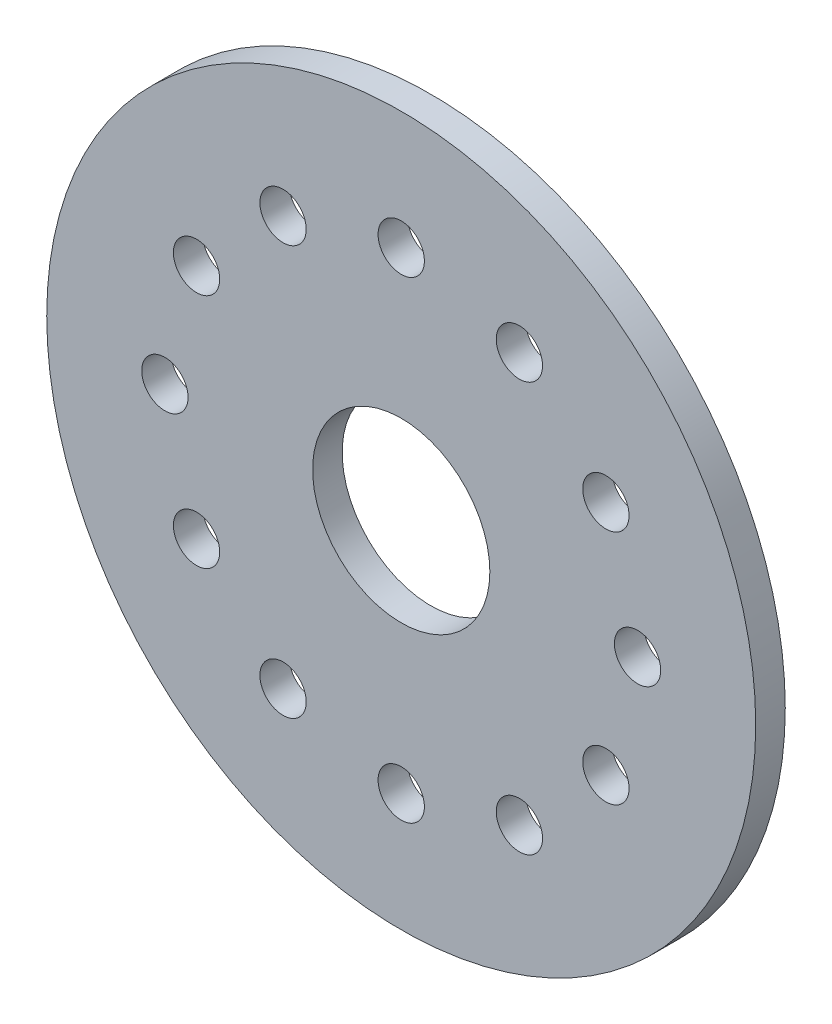
ISO-10303-21;
HEADER;
FILE_DESCRIPTION(('STEP AP214'),'2;1');
FILE_NAME('part.step','',(''),(''),'','','');
FILE_SCHEMA(('AUTOMOTIVE_DESIGN { 1 0 10303 214 1 1 1 1 }'));
ENDSEC;
DATA;
#1=APPLICATION_CONTEXT('core data for automotive mechanical design processes');
#2=APPLICATION_PROTOCOL_DEFINITION('international standard','automotive_design',2000,#1);
#3=PRODUCT_CONTEXT('',#1,'mechanical');
#4=PRODUCT('Part','Part','',(#3));
#5=PRODUCT_RELATED_PRODUCT_CATEGORY('part','',(#4));
#6=PRODUCT_DEFINITION_FORMATION('','',#4);
#7=PRODUCT_DEFINITION_CONTEXT('part definition',#1,'design');
#8=PRODUCT_DEFINITION('design','',#6,#7);
#9=PRODUCT_DEFINITION_SHAPE('','',#8);
#10=(LENGTH_UNIT() NAMED_UNIT(*) SI_UNIT(.MILLI.,.METRE.));
#11=(NAMED_UNIT(*) PLANE_ANGLE_UNIT() SI_UNIT($,.RADIAN.));
#12=(NAMED_UNIT(*) SI_UNIT($,.STERADIAN.) SOLID_ANGLE_UNIT());
#13=UNCERTAINTY_MEASURE_WITH_UNIT(LENGTH_MEASURE(1.E-05),#10,'distance_accuracy_value','');
#14=(GEOMETRIC_REPRESENTATION_CONTEXT(3) GLOBAL_UNCERTAINTY_ASSIGNED_CONTEXT((#13)) GLOBAL_UNIT_ASSIGNED_CONTEXT((#10,
#11,#12)) REPRESENTATION_CONTEXT('',''));
#15=CARTESIAN_POINT('',(0.,0.,0.));
#16=DIRECTION('',(0.,0.,1.));
#17=DIRECTION('',(1.,0.,0.));
#18=AXIS2_PLACEMENT_3D('',#15,#16,#17);
#19=CARTESIAN_POINT('',(0.,0.,3.175));
#20=DIRECTION('',(0.,0.,1.));
#21=DIRECTION('',(1.,0.,0.));
#22=AXIS2_PLACEMENT_3D('',#19,#20,#21);
#23=PLANE('',#22);
#24=CARTESIAN_POINT('',(-21.9970452561247,12.7,3.175));
#25=DIRECTION('',(0.,0.,1.));
#26=DIRECTION('',(1.,0.,0.));
#27=AXIS2_PLACEMENT_3D('',#24,#25,#26);
#28=CIRCLE('',#27,2.4892);
#29=CARTESIAN_POINT('',(-19.5078452561247,12.7,3.175));
#30=VERTEX_POINT('',#29);
#31=EDGE_CURVE('E142',#30,#30,#28,.T.);
#32=ORIENTED_EDGE('',*,*,#31,.F.);
#33=EDGE_LOOP('',(#32));
#34=FACE_BOUND('',#33,.T.);
#35=CARTESIAN_POINT('',(-21.9970452561247,-12.7,3.175));
#36=DIRECTION('',(0.,0.,1.));
#37=DIRECTION('',(1.,0.,0.));
#38=AXIS2_PLACEMENT_3D('',#35,#36,#37);
#39=CIRCLE('',#38,2.4892);
#40=CARTESIAN_POINT('',(-19.5078452561247,-12.7,3.175));
#41=VERTEX_POINT('',#40);
#42=EDGE_CURVE('E126',#41,#41,#39,.T.);
#43=ORIENTED_EDGE('',*,*,#42,.F.);
#44=EDGE_LOOP('',(#43));
#45=FACE_BOUND('',#44,.T.);
#46=CARTESIAN_POINT('',(0.,-25.4,3.175));
#47=DIRECTION('',(0.,0.,1.));
#48=DIRECTION('',(1.,0.,0.));
#49=AXIS2_PLACEMENT_3D('',#46,#47,#48);
#50=CIRCLE('',#49,2.4892);
#51=CARTESIAN_POINT('',(2.4892,-25.4,3.175));
#52=VERTEX_POINT('',#51);
#53=EDGE_CURVE('E110',#52,#52,#50,.T.);
#54=ORIENTED_EDGE('',*,*,#53,.F.);
#55=EDGE_LOOP('',(#54));
#56=FACE_BOUND('',#55,.T.);
#57=CARTESIAN_POINT('',(21.9970452561247,-12.7,3.175));
#58=DIRECTION('',(0.,0.,1.));
#59=DIRECTION('',(1.,0.,0.));
#60=AXIS2_PLACEMENT_3D('',#57,#58,#59);
#61=CIRCLE('',#60,2.4892);
#62=CARTESIAN_POINT('',(24.4862452561247,-12.7,3.175));
#63=VERTEX_POINT('',#62);
#64=EDGE_CURVE('E94',#63,#63,#61,.T.);
#65=ORIENTED_EDGE('',*,*,#64,.F.);
#66=EDGE_LOOP('',(#65));
#67=FACE_BOUND('',#66,.T.);
#68=CARTESIAN_POINT('',(21.9970452561247,12.7,3.175));
#69=DIRECTION('',(0.,0.,1.));
#70=DIRECTION('',(1.,0.,0.));
#71=AXIS2_PLACEMENT_3D('',#68,#69,#70);
#72=CIRCLE('',#71,2.4892);
#73=CARTESIAN_POINT('',(24.4862452561247,12.7,3.175));
#74=VERTEX_POINT('',#73);
#75=EDGE_CURVE('E78',#74,#74,#72,.T.);
#76=ORIENTED_EDGE('',*,*,#75,.F.);
#77=EDGE_LOOP('',(#76));
#78=FACE_BOUND('',#77,.T.);
#79=CARTESIAN_POINT('',(0.,25.4,3.175));
#80=DIRECTION('',(0.,0.,1.));
#81=DIRECTION('',(1.,0.,0.));
#82=AXIS2_PLACEMENT_3D('',#79,#80,#81);
#83=CIRCLE('',#82,2.4892);
#84=CARTESIAN_POINT('',(2.4892,25.4,3.175));
#85=VERTEX_POINT('',#84);
#86=EDGE_CURVE('E62',#85,#85,#83,.T.);
#87=ORIENTED_EDGE('',*,*,#86,.F.);
#88=EDGE_LOOP('',(#87));
#89=FACE_BOUND('',#88,.T.);
#90=CARTESIAN_POINT('',(0.,0.,3.175));
#91=DIRECTION('',(0.,0.,1.));
#92=DIRECTION('',(1.,0.,0.));
#93=AXIS2_PLACEMENT_3D('',#90,#91,#92);
#94=CIRCLE('',#93,38.1);
#95=CARTESIAN_POINT('',(38.1,0.,3.175));
#96=VERTEX_POINT('',#95);
#97=EDGE_CURVE('E10',#96,#96,#94,.T.);
#98=ORIENTED_EDGE('',*,*,#97,.T.);
#99=EDGE_LOOP('',(#98));
#100=FACE_BOUND('',#99,.T.);
#101=CARTESIAN_POINT('',(0.,0.,3.175));
#102=DIRECTION('',(0.,0.,1.));
#103=DIRECTION('',(1.,0.,0.));
#104=AXIS2_PLACEMENT_3D('',#101,#102,#103);
#105=CIRCLE('',#104,9.525);
#106=CARTESIAN_POINT('',(9.525,0.,3.175));
#107=VERTEX_POINT('',#106);
#108=EDGE_CURVE('E56',#107,#107,#105,.T.);
#109=ORIENTED_EDGE('',*,*,#108,.F.);
#110=EDGE_LOOP('',(#109));
#111=FACE_BOUND('',#110,.T.);
#112=CARTESIAN_POINT('',(12.7,21.9970452561247,3.175));
#113=DIRECTION('',(0.,0.,1.));
#114=DIRECTION('',(1.,0.,0.));
#115=AXIS2_PLACEMENT_3D('',#112,#113,#114);
#116=CIRCLE('',#115,2.4892);
#117=CARTESIAN_POINT('',(15.1892,21.9970452561247,3.175));
#118=VERTEX_POINT('',#117);
#119=EDGE_CURVE('E70',#118,#118,#116,.T.);
#120=ORIENTED_EDGE('',*,*,#119,.F.);
#121=EDGE_LOOP('',(#120));
#122=FACE_BOUND('',#121,.T.);
#123=CARTESIAN_POINT('',(25.4,0.,3.175));
#124=DIRECTION('',(0.,0.,1.));
#125=DIRECTION('',(1.,0.,0.));
#126=AXIS2_PLACEMENT_3D('',#123,#124,#125);
#127=CIRCLE('',#126,2.4892);
#128=CARTESIAN_POINT('',(27.8892,0.,3.175));
#129=VERTEX_POINT('',#128);
#130=EDGE_CURVE('E86',#129,#129,#127,.T.);
#131=ORIENTED_EDGE('',*,*,#130,.F.);
#132=EDGE_LOOP('',(#131));
#133=FACE_BOUND('',#132,.T.);
#134=CARTESIAN_POINT('',(12.7,-21.9970452561247,3.175));
#135=DIRECTION('',(0.,0.,1.));
#136=DIRECTION('',(1.,0.,0.));
#137=AXIS2_PLACEMENT_3D('',#134,#135,#136);
#138=CIRCLE('',#137,2.4892);
#139=CARTESIAN_POINT('',(15.1892,-21.9970452561247,3.175));
#140=VERTEX_POINT('',#139);
#141=EDGE_CURVE('E102',#140,#140,#138,.T.);
#142=ORIENTED_EDGE('',*,*,#141,.F.);
#143=EDGE_LOOP('',(#142));
#144=FACE_BOUND('',#143,.T.);
#145=CARTESIAN_POINT('',(-12.7,-21.9970452561247,3.175));
#146=DIRECTION('',(0.,0.,1.));
#147=DIRECTION('',(1.,0.,0.));
#148=AXIS2_PLACEMENT_3D('',#145,#146,#147);
#149=CIRCLE('',#148,2.4892);
#150=CARTESIAN_POINT('',(-10.2108,-21.9970452561247,3.175));
#151=VERTEX_POINT('',#150);
#152=EDGE_CURVE('E118',#151,#151,#149,.T.);
#153=ORIENTED_EDGE('',*,*,#152,.F.);
#154=EDGE_LOOP('',(#153));
#155=FACE_BOUND('',#154,.T.);
#156=CARTESIAN_POINT('',(-25.4,0.,3.175));
#157=DIRECTION('',(0.,0.,1.));
#158=DIRECTION('',(1.,0.,0.));
#159=AXIS2_PLACEMENT_3D('',#156,#157,#158);
#160=CIRCLE('',#159,2.4892);
#161=CARTESIAN_POINT('',(-22.9108,0.,3.175));
#162=VERTEX_POINT('',#161);
#163=EDGE_CURVE('E134',#162,#162,#160,.T.);
#164=ORIENTED_EDGE('',*,*,#163,.F.);
#165=EDGE_LOOP('',(#164));
#166=FACE_BOUND('',#165,.T.);
#167=CARTESIAN_POINT('',(-12.7,21.9970452561247,3.175));
#168=DIRECTION('',(0.,0.,1.));
#169=DIRECTION('',(1.,0.,0.));
#170=AXIS2_PLACEMENT_3D('',#167,#168,#169);
#171=CIRCLE('',#170,2.4892);
#172=CARTESIAN_POINT('',(-10.2108,21.9970452561247,3.175));
#173=VERTEX_POINT('',#172);
#174=EDGE_CURVE('E150',#173,#173,#171,.T.);
#175=ORIENTED_EDGE('',*,*,#174,.F.);
#176=EDGE_LOOP('',(#175));
#177=FACE_BOUND('',#176,.T.);
#178=ADVANCED_FACE('F43',(#34,#45,#56,#67,#78,#89,#100,#111,#122,#133,#144,#155,#166,#177),#23,.T.);
#179=CARTESIAN_POINT('',(0.,0.,0.));
#180=DIRECTION('',(0.,0.,1.));
#181=DIRECTION('',(1.,0.,0.));
#182=AXIS2_PLACEMENT_3D('',#179,#180,#181);
#183=PLANE('',#182);
#184=CARTESIAN_POINT('',(0.,0.,0.));
#185=DIRECTION('',(0.,0.,1.));
#186=DIRECTION('',(1.,0.,0.));
#187=AXIS2_PLACEMENT_3D('',#184,#185,#186);
#188=CIRCLE('',#187,38.1);
#189=CARTESIAN_POINT('',(38.1,0.,0.));
#190=VERTEX_POINT('',#189);
#191=EDGE_CURVE('E47',#190,#190,#188,.T.);
#192=ORIENTED_EDGE('',*,*,#191,.F.);
#193=EDGE_LOOP('',(#192));
#194=FACE_BOUND('',#193,.T.);
#195=CARTESIAN_POINT('',(0.,0.,0.));
#196=DIRECTION('',(0.,0.,1.));
#197=DIRECTION('',(1.,0.,0.));
#198=AXIS2_PLACEMENT_3D('',#195,#196,#197);
#199=CIRCLE('',#198,9.525);
#200=CARTESIAN_POINT('',(9.525,0.,0.));
#201=VERTEX_POINT('',#200);
#202=EDGE_CURVE('E58',#201,#201,#199,.T.);
#203=ORIENTED_EDGE('',*,*,#202,.T.);
#204=EDGE_LOOP('',(#203));
#205=FACE_BOUND('',#204,.T.);
#206=CARTESIAN_POINT('',(0.,25.4,0.));
#207=DIRECTION('',(0.,0.,1.));
#208=DIRECTION('',(1.,0.,0.));
#209=AXIS2_PLACEMENT_3D('',#206,#207,#208);
#210=CIRCLE('',#209,2.4892);
#211=CARTESIAN_POINT('',(2.4892,25.4,0.));
#212=VERTEX_POINT('',#211);
#213=EDGE_CURVE('E66',#212,#212,#210,.T.);
#214=ORIENTED_EDGE('',*,*,#213,.T.);
#215=EDGE_LOOP('',(#214));
#216=FACE_BOUND('',#215,.T.);
#217=CARTESIAN_POINT('',(12.7,21.9970452561247,0.));
#218=DIRECTION('',(0.,0.,1.));
#219=DIRECTION('',(1.,0.,0.));
#220=AXIS2_PLACEMENT_3D('',#217,#218,#219);
#221=CIRCLE('',#220,2.4892);
#222=CARTESIAN_POINT('',(15.1892,21.9970452561247,0.));
#223=VERTEX_POINT('',#222);
#224=EDGE_CURVE('E74',#223,#223,#221,.T.);
#225=ORIENTED_EDGE('',*,*,#224,.T.);
#226=EDGE_LOOP('',(#225));
#227=FACE_BOUND('',#226,.T.);
#228=CARTESIAN_POINT('',(21.9970452561247,12.7,0.));
#229=DIRECTION('',(0.,0.,1.));
#230=DIRECTION('',(1.,0.,0.));
#231=AXIS2_PLACEMENT_3D('',#228,#229,#230);
#232=CIRCLE('',#231,2.4892);
#233=CARTESIAN_POINT('',(24.4862452561247,12.7,0.));
#234=VERTEX_POINT('',#233);
#235=EDGE_CURVE('E82',#234,#234,#232,.T.);
#236=ORIENTED_EDGE('',*,*,#235,.T.);
#237=EDGE_LOOP('',(#236));
#238=FACE_BOUND('',#237,.T.);
#239=CARTESIAN_POINT('',(25.4,0.,0.));
#240=DIRECTION('',(0.,0.,1.));
#241=DIRECTION('',(1.,0.,0.));
#242=AXIS2_PLACEMENT_3D('',#239,#240,#241);
#243=CIRCLE('',#242,2.4892);
#244=CARTESIAN_POINT('',(27.8892,0.,0.));
#245=VERTEX_POINT('',#244);
#246=EDGE_CURVE('E90',#245,#245,#243,.T.);
#247=ORIENTED_EDGE('',*,*,#246,.T.);
#248=EDGE_LOOP('',(#247));
#249=FACE_BOUND('',#248,.T.);
#250=CARTESIAN_POINT('',(21.9970452561247,-12.7,0.));
#251=DIRECTION('',(0.,0.,1.));
#252=DIRECTION('',(1.,0.,0.));
#253=AXIS2_PLACEMENT_3D('',#250,#251,#252);
#254=CIRCLE('',#253,2.4892);
#255=CARTESIAN_POINT('',(24.4862452561247,-12.7,0.));
#256=VERTEX_POINT('',#255);
#257=EDGE_CURVE('E98',#256,#256,#254,.T.);
#258=ORIENTED_EDGE('',*,*,#257,.T.);
#259=EDGE_LOOP('',(#258));
#260=FACE_BOUND('',#259,.T.);
#261=CARTESIAN_POINT('',(12.7,-21.9970452561247,0.));
#262=DIRECTION('',(0.,0.,1.));
#263=DIRECTION('',(1.,0.,0.));
#264=AXIS2_PLACEMENT_3D('',#261,#262,#263);
#265=CIRCLE('',#264,2.4892);
#266=CARTESIAN_POINT('',(15.1892,-21.9970452561247,0.));
#267=VERTEX_POINT('',#266);
#268=EDGE_CURVE('E106',#267,#267,#265,.T.);
#269=ORIENTED_EDGE('',*,*,#268,.T.);
#270=EDGE_LOOP('',(#269));
#271=FACE_BOUND('',#270,.T.);
#272=CARTESIAN_POINT('',(0.,-25.4,0.));
#273=DIRECTION('',(0.,0.,1.));
#274=DIRECTION('',(1.,0.,0.));
#275=AXIS2_PLACEMENT_3D('',#272,#273,#274);
#276=CIRCLE('',#275,2.4892);
#277=CARTESIAN_POINT('',(2.4892,-25.4,0.));
#278=VERTEX_POINT('',#277);
#279=EDGE_CURVE('E114',#278,#278,#276,.T.);
#280=ORIENTED_EDGE('',*,*,#279,.T.);
#281=EDGE_LOOP('',(#280));
#282=FACE_BOUND('',#281,.T.);
#283=CARTESIAN_POINT('',(-12.7,-21.9970452561247,0.));
#284=DIRECTION('',(0.,0.,1.));
#285=DIRECTION('',(1.,0.,0.));
#286=AXIS2_PLACEMENT_3D('',#283,#284,#285);
#287=CIRCLE('',#286,2.4892);
#288=CARTESIAN_POINT('',(-10.2108,-21.9970452561247,0.));
#289=VERTEX_POINT('',#288);
#290=EDGE_CURVE('E122',#289,#289,#287,.T.);
#291=ORIENTED_EDGE('',*,*,#290,.T.);
#292=EDGE_LOOP('',(#291));
#293=FACE_BOUND('',#292,.T.);
#294=CARTESIAN_POINT('',(-21.9970452561247,-12.7,0.));
#295=DIRECTION('',(0.,0.,1.));
#296=DIRECTION('',(1.,0.,0.));
#297=AXIS2_PLACEMENT_3D('',#294,#295,#296);
#298=CIRCLE('',#297,2.4892);
#299=CARTESIAN_POINT('',(-19.5078452561247,-12.7,0.));
#300=VERTEX_POINT('',#299);
#301=EDGE_CURVE('E130',#300,#300,#298,.T.);
#302=ORIENTED_EDGE('',*,*,#301,.T.);
#303=EDGE_LOOP('',(#302));
#304=FACE_BOUND('',#303,.T.);
#305=CARTESIAN_POINT('',(-25.4,0.,0.));
#306=DIRECTION('',(0.,0.,1.));
#307=DIRECTION('',(1.,0.,0.));
#308=AXIS2_PLACEMENT_3D('',#305,#306,#307);
#309=CIRCLE('',#308,2.4892);
#310=CARTESIAN_POINT('',(-22.9108,0.,0.));
#311=VERTEX_POINT('',#310);
#312=EDGE_CURVE('E138',#311,#311,#309,.T.);
#313=ORIENTED_EDGE('',*,*,#312,.T.);
#314=EDGE_LOOP('',(#313));
#315=FACE_BOUND('',#314,.T.);
#316=CARTESIAN_POINT('',(-21.9970452561247,12.7,0.));
#317=DIRECTION('',(0.,0.,1.));
#318=DIRECTION('',(1.,0.,0.));
#319=AXIS2_PLACEMENT_3D('',#316,#317,#318);
#320=CIRCLE('',#319,2.4892);
#321=CARTESIAN_POINT('',(-19.5078452561247,12.7,0.));
#322=VERTEX_POINT('',#321);
#323=EDGE_CURVE('E146',#322,#322,#320,.T.);
#324=ORIENTED_EDGE('',*,*,#323,.T.);
#325=EDGE_LOOP('',(#324));
#326=FACE_BOUND('',#325,.T.);
#327=CARTESIAN_POINT('',(-12.7,21.9970452561247,0.));
#328=DIRECTION('',(0.,0.,1.));
#329=DIRECTION('',(1.,0.,0.));
#330=AXIS2_PLACEMENT_3D('',#327,#328,#329);
#331=CIRCLE('',#330,2.4892);
#332=CARTESIAN_POINT('',(-10.2108,21.9970452561247,0.));
#333=VERTEX_POINT('',#332);
#334=EDGE_CURVE('E154',#333,#333,#331,.T.);
#335=ORIENTED_EDGE('',*,*,#334,.T.);
#336=EDGE_LOOP('',(#335));
#337=FACE_BOUND('',#336,.T.);
#338=ADVANCED_FACE('F166',(#194,#205,#216,#227,#238,#249,#260,#271,#282,#293,#304,#315,#326,
#337),#183,.F.);
#339=CARTESIAN_POINT('',(0.,0.,3.175));
#340=DIRECTION('',(0.,0.,-1.));
#341=DIRECTION('',(-1.,0.,0.));
#342=AXIS2_PLACEMENT_3D('',#339,#340,#341);
#343=CYLINDRICAL_SURFACE('',#342,38.1);
#344=ORIENTED_EDGE('',*,*,#97,.F.);
#345=EDGE_LOOP('',(#344));
#346=FACE_BOUND('',#345,.T.);
#347=ORIENTED_EDGE('',*,*,#191,.T.);
#348=EDGE_LOOP('',(#347));
#349=FACE_BOUND('',#348,.T.);
#350=ADVANCED_FACE('F45',(#346,#349),#343,.T.);
#351=CARTESIAN_POINT('',(0.,0.,3.175));
#352=DIRECTION('',(0.,0.,-1.));
#353=DIRECTION('',(-1.,0.,0.));
#354=AXIS2_PLACEMENT_3D('',#351,#352,#353);
#355=CYLINDRICAL_SURFACE('',#354,9.525);
#356=ORIENTED_EDGE('',*,*,#108,.T.);
#357=EDGE_LOOP('',(#356));
#358=FACE_BOUND('',#357,.T.);
#359=ORIENTED_EDGE('',*,*,#202,.F.);
#360=EDGE_LOOP('',(#359));
#361=FACE_BOUND('',#360,.T.);
#362=ADVANCED_FACE('F176',(#358,#361),#355,.F.);
#363=CARTESIAN_POINT('',(0.,25.4,3.175));
#364=DIRECTION('',(0.,0.,-1.));
#365=DIRECTION('',(-1.,0.,0.));
#366=AXIS2_PLACEMENT_3D('',#363,#364,#365);
#367=CYLINDRICAL_SURFACE('',#366,2.4892);
#368=ORIENTED_EDGE('',*,*,#86,.T.);
#369=EDGE_LOOP('',(#368));
#370=FACE_BOUND('',#369,.T.);
#371=ORIENTED_EDGE('',*,*,#213,.F.);
#372=EDGE_LOOP('',(#371));
#373=FACE_BOUND('',#372,.T.);
#374=ADVANCED_FACE('F179',(#370,#373),#367,.F.);
#375=CARTESIAN_POINT('',(12.7,21.9970452561247,3.175));
#376=DIRECTION('',(0.,0.,-1.));
#377=DIRECTION('',(-1.,0.,0.));
#378=AXIS2_PLACEMENT_3D('',#375,#376,#377);
#379=CYLINDRICAL_SURFACE('',#378,2.4892);
#380=ORIENTED_EDGE('',*,*,#119,.T.);
#381=EDGE_LOOP('',(#380));
#382=FACE_BOUND('',#381,.T.);
#383=ORIENTED_EDGE('',*,*,#224,.F.);
#384=EDGE_LOOP('',(#383));
#385=FACE_BOUND('',#384,.T.);
#386=ADVANCED_FACE('F183',(#382,#385),#379,.F.);
#387=CARTESIAN_POINT('',(21.9970452561247,12.7,3.175));
#388=DIRECTION('',(0.,0.,-1.));
#389=DIRECTION('',(-1.,0.,0.));
#390=AXIS2_PLACEMENT_3D('',#387,#388,#389);
#391=CYLINDRICAL_SURFACE('',#390,2.4892);
#392=ORIENTED_EDGE('',*,*,#75,.T.);
#393=EDGE_LOOP('',(#392));
#394=FACE_BOUND('',#393,.T.);
#395=ORIENTED_EDGE('',*,*,#235,.F.);
#396=EDGE_LOOP('',(#395));
#397=FACE_BOUND('',#396,.T.);
#398=ADVANCED_FACE('F187',(#394,#397),#391,.F.);
#399=CARTESIAN_POINT('',(25.4,0.,3.175));
#400=DIRECTION('',(0.,0.,-1.));
#401=DIRECTION('',(-1.,0.,0.));
#402=AXIS2_PLACEMENT_3D('',#399,#400,#401);
#403=CYLINDRICAL_SURFACE('',#402,2.4892);
#404=ORIENTED_EDGE('',*,*,#130,.T.);
#405=EDGE_LOOP('',(#404));
#406=FACE_BOUND('',#405,.T.);
#407=ORIENTED_EDGE('',*,*,#246,.F.);
#408=EDGE_LOOP('',(#407));
#409=FACE_BOUND('',#408,.T.);
#410=ADVANCED_FACE('F191',(#406,#409),#403,.F.);
#411=CARTESIAN_POINT('',(21.9970452561247,-12.7,3.175));
#412=DIRECTION('',(0.,0.,-1.));
#413=DIRECTION('',(-1.,0.,0.));
#414=AXIS2_PLACEMENT_3D('',#411,#412,#413);
#415=CYLINDRICAL_SURFACE('',#414,2.4892);
#416=ORIENTED_EDGE('',*,*,#64,.T.);
#417=EDGE_LOOP('',(#416));
#418=FACE_BOUND('',#417,.T.);
#419=ORIENTED_EDGE('',*,*,#257,.F.);
#420=EDGE_LOOP('',(#419));
#421=FACE_BOUND('',#420,.T.);
#422=ADVANCED_FACE('F195',(#418,#421),#415,.F.);
#423=CARTESIAN_POINT('',(12.7,-21.9970452561247,3.175));
#424=DIRECTION('',(0.,0.,-1.));
#425=DIRECTION('',(-1.,0.,0.));
#426=AXIS2_PLACEMENT_3D('',#423,#424,#425);
#427=CYLINDRICAL_SURFACE('',#426,2.4892);
#428=ORIENTED_EDGE('',*,*,#141,.T.);
#429=EDGE_LOOP('',(#428));
#430=FACE_BOUND('',#429,.T.);
#431=ORIENTED_EDGE('',*,*,#268,.F.);
#432=EDGE_LOOP('',(#431));
#433=FACE_BOUND('',#432,.T.);
#434=ADVANCED_FACE('F199',(#430,#433),#427,.F.);
#435=CARTESIAN_POINT('',(0.,-25.4,3.175));
#436=DIRECTION('',(0.,0.,-1.));
#437=DIRECTION('',(-1.,0.,0.));
#438=AXIS2_PLACEMENT_3D('',#435,#436,#437);
#439=CYLINDRICAL_SURFACE('',#438,2.4892);
#440=ORIENTED_EDGE('',*,*,#53,.T.);
#441=EDGE_LOOP('',(#440));
#442=FACE_BOUND('',#441,.T.);
#443=ORIENTED_EDGE('',*,*,#279,.F.);
#444=EDGE_LOOP('',(#443));
#445=FACE_BOUND('',#444,.T.);
#446=ADVANCED_FACE('F203',(#442,#445),#439,.F.);
#447=CARTESIAN_POINT('',(-12.7,-21.9970452561247,3.175));
#448=DIRECTION('',(0.,0.,-1.));
#449=DIRECTION('',(-1.,0.,0.));
#450=AXIS2_PLACEMENT_3D('',#447,#448,#449);
#451=CYLINDRICAL_SURFACE('',#450,2.4892);
#452=ORIENTED_EDGE('',*,*,#152,.T.);
#453=EDGE_LOOP('',(#452));
#454=FACE_BOUND('',#453,.T.);
#455=ORIENTED_EDGE('',*,*,#290,.F.);
#456=EDGE_LOOP('',(#455));
#457=FACE_BOUND('',#456,.T.);
#458=ADVANCED_FACE('F207',(#454,#457),#451,.F.);
#459=CARTESIAN_POINT('',(-21.9970452561247,-12.7,3.175));
#460=DIRECTION('',(0.,0.,-1.));
#461=DIRECTION('',(-1.,0.,0.));
#462=AXIS2_PLACEMENT_3D('',#459,#460,#461);
#463=CYLINDRICAL_SURFACE('',#462,2.4892);
#464=ORIENTED_EDGE('',*,*,#42,.T.);
#465=EDGE_LOOP('',(#464));
#466=FACE_BOUND('',#465,.T.);
#467=ORIENTED_EDGE('',*,*,#301,.F.);
#468=EDGE_LOOP('',(#467));
#469=FACE_BOUND('',#468,.T.);
#470=ADVANCED_FACE('F211',(#466,#469),#463,.F.);
#471=CARTESIAN_POINT('',(-25.4,0.,3.175));
#472=DIRECTION('',(0.,0.,-1.));
#473=DIRECTION('',(-1.,0.,0.));
#474=AXIS2_PLACEMENT_3D('',#471,#472,#473);
#475=CYLINDRICAL_SURFACE('',#474,2.4892);
#476=ORIENTED_EDGE('',*,*,#163,.T.);
#477=EDGE_LOOP('',(#476));
#478=FACE_BOUND('',#477,.T.);
#479=ORIENTED_EDGE('',*,*,#312,.F.);
#480=EDGE_LOOP('',(#479));
#481=FACE_BOUND('',#480,.T.);
#482=ADVANCED_FACE('F215',(#478,#481),#475,.F.);
#483=CARTESIAN_POINT('',(-21.9970452561247,12.7,3.175));
#484=DIRECTION('',(0.,0.,-1.));
#485=DIRECTION('',(-1.,0.,0.));
#486=AXIS2_PLACEMENT_3D('',#483,#484,#485);
#487=CYLINDRICAL_SURFACE('',#486,2.4892);
#488=ORIENTED_EDGE('',*,*,#31,.T.);
#489=EDGE_LOOP('',(#488));
#490=FACE_BOUND('',#489,.T.);
#491=ORIENTED_EDGE('',*,*,#323,.F.);
#492=EDGE_LOOP('',(#491));
#493=FACE_BOUND('',#492,.T.);
#494=ADVANCED_FACE('F219',(#490,#493),#487,.F.);
#495=CARTESIAN_POINT('',(-12.7,21.9970452561247,3.175));
#496=DIRECTION('',(0.,0.,-1.));
#497=DIRECTION('',(-1.,0.,0.));
#498=AXIS2_PLACEMENT_3D('',#495,#496,#497);
#499=CYLINDRICAL_SURFACE('',#498,2.4892);
#500=ORIENTED_EDGE('',*,*,#174,.T.);
#501=EDGE_LOOP('',(#500));
#502=FACE_BOUND('',#501,.T.);
#503=ORIENTED_EDGE('',*,*,#334,.F.);
#504=EDGE_LOOP('',(#503));
#505=FACE_BOUND('',#504,.T.);
#506=ADVANCED_FACE('F162',(#502,#505),#499,.F.);
#507=CLOSED_SHELL('',(#178,#338,#350,#362,#374,#386,#398,#410,#422,#434,#446,#458,#470,#482,
#494,#506));
#508=MANIFOLD_SOLID_BREP('B2',#507);
#509=ADVANCED_BREP_SHAPE_REPRESENTATION('',(#18,#508),#14);
#510=SHAPE_DEFINITION_REPRESENTATION(#9,#509);
ENDSEC;
END-ISO-10303-21;
